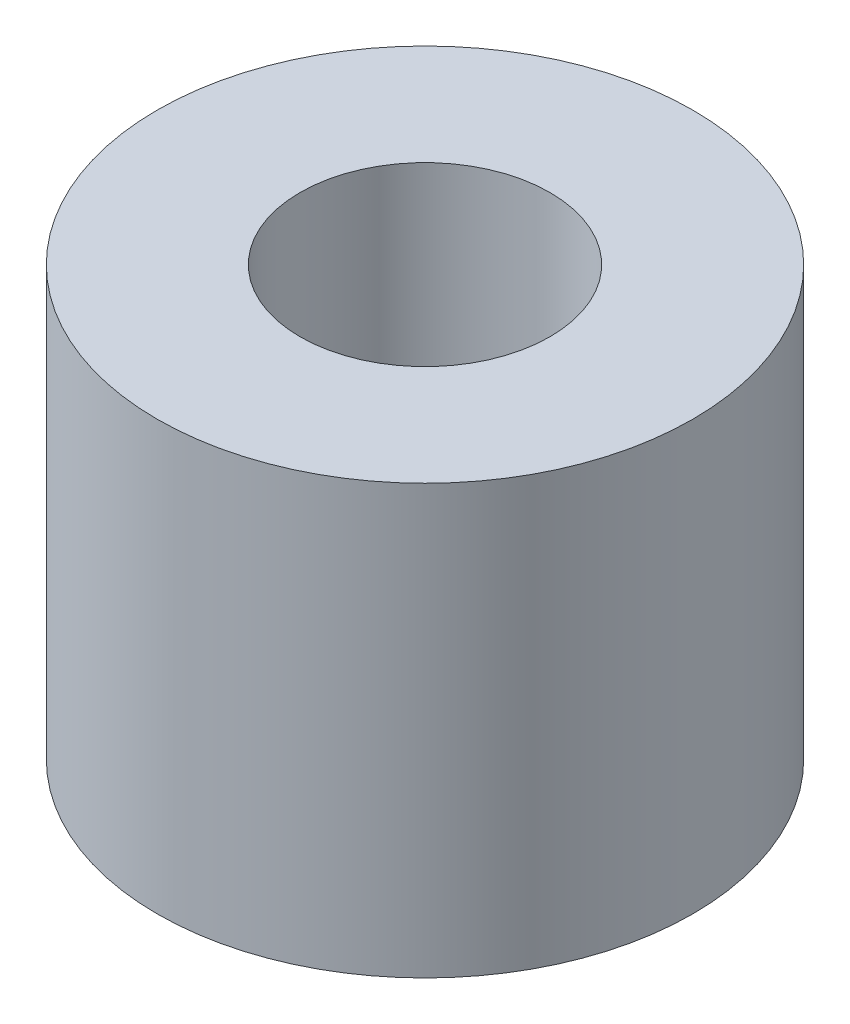
ISO-10303-21;
HEADER;
FILE_DESCRIPTION(('STEP AP214'),'2;1');
FILE_NAME('part.step','',(''),(''),'','','');
FILE_SCHEMA(('AUTOMOTIVE_DESIGN { 1 0 10303 214 1 1 1 1 }'));
ENDSEC;
DATA;
#1=APPLICATION_CONTEXT('core data for automotive mechanical design processes');
#2=APPLICATION_PROTOCOL_DEFINITION('international standard','automotive_design',2000,#1);
#3=PRODUCT_CONTEXT('',#1,'mechanical');
#4=PRODUCT('Part','Part','',(#3));
#5=PRODUCT_RELATED_PRODUCT_CATEGORY('part','',(#4));
#6=PRODUCT_DEFINITION_FORMATION('','',#4);
#7=PRODUCT_DEFINITION_CONTEXT('part definition',#1,'design');
#8=PRODUCT_DEFINITION('design','',#6,#7);
#9=PRODUCT_DEFINITION_SHAPE('','',#8);
#10=(LENGTH_UNIT() NAMED_UNIT(*) SI_UNIT(.MILLI.,.METRE.));
#11=(NAMED_UNIT(*) PLANE_ANGLE_UNIT() SI_UNIT($,.RADIAN.));
#12=(NAMED_UNIT(*) SI_UNIT($,.STERADIAN.) SOLID_ANGLE_UNIT());
#13=UNCERTAINTY_MEASURE_WITH_UNIT(LENGTH_MEASURE(1.E-05),#10,'distance_accuracy_value','');
#14=(GEOMETRIC_REPRESENTATION_CONTEXT(3) GLOBAL_UNCERTAINTY_ASSIGNED_CONTEXT((#13)) GLOBAL_UNIT_ASSIGNED_CONTEXT((#10,
#11,#12)) REPRESENTATION_CONTEXT('',''));
#15=CARTESIAN_POINT('',(0.,0.,0.));
#16=DIRECTION('',(0.,0.,1.));
#17=DIRECTION('',(1.,0.,0.));
#18=AXIS2_PLACEMENT_3D('',#15,#16,#17);
#19=CARTESIAN_POINT('',(0.,38.1,0.));
#20=DIRECTION('',(0.,1.,0.));
#21=DIRECTION('',(0.,0.,1.));
#22=AXIS2_PLACEMENT_3D('',#19,#20,#21);
#23=PLANE('',#22);
#24=CARTESIAN_POINT('',(0.,38.1,0.));
#25=DIRECTION('',(0.,1.,0.));
#26=DIRECTION('',(0.,0.,1.));
#27=AXIS2_PLACEMENT_3D('',#24,#25,#26);
#28=CIRCLE('',#27,23.8125);
#29=CARTESIAN_POINT('',(0.,38.1,-23.8125));
#30=VERTEX_POINT('',#29);
#31=EDGE_CURVE('E10',#30,#30,#28,.T.);
#32=ORIENTED_EDGE('',*,*,#31,.T.);
#33=EDGE_LOOP('',(#32));
#34=FACE_BOUND('',#33,.T.);
#35=CARTESIAN_POINT('',(0.,38.1,0.));
#36=DIRECTION('',(0.,1.,0.));
#37=DIRECTION('',(0.,0.,1.));
#38=AXIS2_PLACEMENT_3D('',#35,#36,#37);
#39=CIRCLE('',#38,11.1125);
#40=CARTESIAN_POINT('',(0.,38.1,-11.1125));
#41=VERTEX_POINT('',#40);
#42=EDGE_CURVE('E56',#41,#41,#39,.T.);
#43=ORIENTED_EDGE('',*,*,#42,.F.);
#44=EDGE_LOOP('',(#43));
#45=FACE_BOUND('',#44,.T.);
#46=ADVANCED_FACE('F43',(#34,#45),#23,.T.);
#47=CARTESIAN_POINT('',(0.,0.,0.));
#48=DIRECTION('',(0.,1.,0.));
#49=DIRECTION('',(0.,0.,1.));
#50=AXIS2_PLACEMENT_3D('',#47,#48,#49);
#51=PLANE('',#50);
#52=CARTESIAN_POINT('',(0.,0.,0.));
#53=DIRECTION('',(0.,1.,0.));
#54=DIRECTION('',(0.,0.,1.));
#55=AXIS2_PLACEMENT_3D('',#52,#53,#54);
#56=CIRCLE('',#55,23.8125);
#57=CARTESIAN_POINT('',(0.,0.,-23.8125));
#58=VERTEX_POINT('',#57);
#59=EDGE_CURVE('E47',#58,#58,#56,.T.);
#60=ORIENTED_EDGE('',*,*,#59,.F.);
#61=EDGE_LOOP('',(#60));
#62=FACE_BOUND('',#61,.T.);
#63=CARTESIAN_POINT('',(0.,0.,0.));
#64=DIRECTION('',(0.,1.,0.));
#65=DIRECTION('',(0.,0.,1.));
#66=AXIS2_PLACEMENT_3D('',#63,#64,#65);
#67=CIRCLE('',#66,11.1125);
#68=CARTESIAN_POINT('',(0.,0.,-11.1125));
#69=VERTEX_POINT('',#68);
#70=EDGE_CURVE('E58',#69,#69,#67,.T.);
#71=ORIENTED_EDGE('',*,*,#70,.T.);
#72=EDGE_LOOP('',(#71));
#73=FACE_BOUND('',#72,.T.);
#74=ADVANCED_FACE('F70',(#62,#73),#51,.F.);
#75=CARTESIAN_POINT('',(0.,38.1,0.));
#76=DIRECTION('',(0.,-1.,0.));
#77=DIRECTION('',(0.,0.,-1.));
#78=AXIS2_PLACEMENT_3D('',#75,#76,#77);
#79=CYLINDRICAL_SURFACE('',#78,23.8125);
#80=CARTESIAN_POINT('',(0.,38.1,-23.8125));
#81=CARTESIAN_POINT('',(0.,37.703125,-23.8125));
#82=CARTESIAN_POINT('',(0.,37.30625,-23.8125));
#83=CARTESIAN_POINT('',(0.,36.5125,-23.8125));
#84=CARTESIAN_POINT('',(0.,36.115625,-23.8125));
#85=CARTESIAN_POINT('',(0.,35.321875,-23.8125));
#86=CARTESIAN_POINT('',(0.,34.925,-23.8125));
#87=CARTESIAN_POINT('',(0.,34.13125,-23.8125));
#88=CARTESIAN_POINT('',(0.,33.734375,-23.8125));
#89=CARTESIAN_POINT('',(0.,32.940625,-23.8125));
#90=CARTESIAN_POINT('',(0.,32.54375,-23.8125));
#91=CARTESIAN_POINT('',(0.,31.75,-23.8125));
#92=CARTESIAN_POINT('',(0.,31.353125,-23.8125));
#93=CARTESIAN_POINT('',(0.,30.559375,-23.8125));
#94=CARTESIAN_POINT('',(0.,30.1625,-23.8125));
#95=CARTESIAN_POINT('',(0.,29.36875,-23.8125));
#96=CARTESIAN_POINT('',(0.,28.971875,-23.8125));
#97=CARTESIAN_POINT('',(0.,28.178125,-23.8125));
#98=CARTESIAN_POINT('',(0.,27.78125,-23.8125));
#99=CARTESIAN_POINT('',(0.,26.9875,-23.8125));
#100=CARTESIAN_POINT('',(0.,26.590625,-23.8125));
#101=CARTESIAN_POINT('',(0.,25.796875,-23.8125));
#102=CARTESIAN_POINT('',(0.,25.4,-23.8125));
#103=CARTESIAN_POINT('',(0.,24.60625,-23.8125));
#104=CARTESIAN_POINT('',(0.,24.209375,-23.8125));
#105=CARTESIAN_POINT('',(0.,23.415625,-23.8125));
#106=CARTESIAN_POINT('',(0.,23.01875,-23.8125));
#107=CARTESIAN_POINT('',(0.,22.225,-23.8125));
#108=CARTESIAN_POINT('',(0.,21.828125,-23.8125));
#109=CARTESIAN_POINT('',(0.,21.034375,-23.8125));
#110=CARTESIAN_POINT('',(0.,20.6375,-23.8125));
#111=CARTESIAN_POINT('',(0.,19.84375,-23.8125));
#112=CARTESIAN_POINT('',(0.,19.446875,-23.8125));
#113=CARTESIAN_POINT('',(0.,18.653125,-23.8125));
#114=CARTESIAN_POINT('',(0.,18.25625,-23.8125));
#115=CARTESIAN_POINT('',(0.,17.4625,-23.8125));
#116=CARTESIAN_POINT('',(0.,17.065625,-23.8125));
#117=CARTESIAN_POINT('',(0.,16.271875,-23.8125));
#118=CARTESIAN_POINT('',(0.,15.875,-23.8125));
#119=CARTESIAN_POINT('',(0.,15.08125,-23.8125));
#120=CARTESIAN_POINT('',(0.,14.684375,-23.8125));
#121=CARTESIAN_POINT('',(0.,13.890625,-23.8125));
#122=CARTESIAN_POINT('',(0.,13.49375,-23.8125));
#123=CARTESIAN_POINT('',(0.,12.7,-23.8125));
#124=CARTESIAN_POINT('',(0.,12.303125,-23.8125));
#125=CARTESIAN_POINT('',(0.,11.509375,-23.8125));
#126=CARTESIAN_POINT('',(0.,11.1125,-23.8125));
#127=CARTESIAN_POINT('',(0.,10.31875,-23.8125));
#128=CARTESIAN_POINT('',(0.,9.921875,-23.8125));
#129=CARTESIAN_POINT('',(0.,9.128125,-23.8125));
#130=CARTESIAN_POINT('',(0.,8.73125,-23.8125));
#131=CARTESIAN_POINT('',(0.,7.9375,-23.8125));
#132=CARTESIAN_POINT('',(0.,7.540625,-23.8125));
#133=CARTESIAN_POINT('',(0.,6.746875,-23.8125));
#134=CARTESIAN_POINT('',(0.,6.35,-23.8125));
#135=CARTESIAN_POINT('',(0.,5.55625,-23.8125));
#136=CARTESIAN_POINT('',(0.,5.159375,-23.8125));
#137=CARTESIAN_POINT('',(0.,4.365625,-23.8125));
#138=CARTESIAN_POINT('',(0.,3.96875,-23.8125));
#139=CARTESIAN_POINT('',(0.,3.175,-23.8125));
#140=CARTESIAN_POINT('',(0.,2.778125,-23.8125));
#141=CARTESIAN_POINT('',(0.,1.984375,-23.8125));
#142=CARTESIAN_POINT('',(0.,1.5875,-23.8125));
#143=CARTESIAN_POINT('',(0.,0.79375,-23.8125));
#144=CARTESIAN_POINT('',(0.,0.396875,-23.8125));
#145=CARTESIAN_POINT('',(0.,0.,-23.8125));
#146=B_SPLINE_CURVE_WITH_KNOTS('',3,(#80,#81,#82,#83,#84,#85,#86,#87,#88,#89,#90,#91,#92,#93,
#94,#95,#96,#97,#98,#99,#100,#101,#102,#103,#104,#105,#106,#107,#108,#109,#110,#111,#112,#113,
#114,#115,#116,#117,#118,#119,#120,#121,#122,#123,#124,#125,#126,#127,#128,#129,#130,#131,#132,
#133,#134,#135,#136,#137,#138,#139,#140,#141,#142,#143,#144,#145),.UNSPECIFIED.,.F.,.F.,(4,2,2,
2,2,2,2,2,2,2,2,2,2,2,2,2,2,2,2,2,2,2,2,2,2,2,2,2,2,2,2,2,4),(0.,1.19062499999999,
2.38124999999999,3.571875,4.7625,5.953125,7.14375,8.33437499999999,9.525,10.715625,11.90625,
13.096875,14.2875,15.478125,16.66875,17.859375,19.05,20.240625,21.43125,22.621875,23.8125,
25.003125,26.19375,27.384375,28.575,29.765625,30.95625,32.146875,33.3375,34.528125,35.71875,
36.909375,38.1),.UNSPECIFIED.);
#147=EDGE_CURVE('BSEAM45',#30,#58,#146,.T.);
#148=ORIENTED_EDGE('',*,*,#31,.F.);
#149=ORIENTED_EDGE('',*,*,#59,.T.);
#150=ORIENTED_EDGE('',*,*,#147,.T.);
#151=ORIENTED_EDGE('',*,*,#147,.F.);
#152=EDGE_LOOP('',(#148,#150,#149,#151));
#153=FACE_BOUND('',#152,.T.);
#154=ADVANCED_FACE('F45',(#153),#79,.T.);
#155=CARTESIAN_POINT('',(0.,38.1,0.));
#156=DIRECTION('',(0.,-1.,0.));
#157=DIRECTION('',(0.,0.,-1.));
#158=AXIS2_PLACEMENT_3D('',#155,#156,#157);
#159=CYLINDRICAL_SURFACE('',#158,11.1125);
#160=CARTESIAN_POINT('',(0.,38.1,-11.1125));
#161=CARTESIAN_POINT('',(0.,37.703125,-11.1125));
#162=CARTESIAN_POINT('',(0.,37.30625,-11.1125));
#163=CARTESIAN_POINT('',(0.,36.5125,-11.1125));
#164=CARTESIAN_POINT('',(0.,36.115625,-11.1125));
#165=CARTESIAN_POINT('',(0.,35.321875,-11.1125));
#166=CARTESIAN_POINT('',(0.,34.925,-11.1125));
#167=CARTESIAN_POINT('',(0.,34.13125,-11.1125));
#168=CARTESIAN_POINT('',(0.,33.734375,-11.1125));
#169=CARTESIAN_POINT('',(0.,32.940625,-11.1125));
#170=CARTESIAN_POINT('',(0.,32.54375,-11.1125));
#171=CARTESIAN_POINT('',(0.,31.75,-11.1125));
#172=CARTESIAN_POINT('',(0.,31.353125,-11.1125));
#173=CARTESIAN_POINT('',(0.,30.559375,-11.1125));
#174=CARTESIAN_POINT('',(0.,30.1625,-11.1125));
#175=CARTESIAN_POINT('',(0.,29.36875,-11.1125));
#176=CARTESIAN_POINT('',(0.,28.971875,-11.1125));
#177=CARTESIAN_POINT('',(0.,28.178125,-11.1125));
#178=CARTESIAN_POINT('',(0.,27.78125,-11.1125));
#179=CARTESIAN_POINT('',(0.,26.9875,-11.1125));
#180=CARTESIAN_POINT('',(0.,26.590625,-11.1125));
#181=CARTESIAN_POINT('',(0.,25.796875,-11.1125));
#182=CARTESIAN_POINT('',(0.,25.4,-11.1125));
#183=CARTESIAN_POINT('',(0.,24.60625,-11.1125));
#184=CARTESIAN_POINT('',(0.,24.209375,-11.1125));
#185=CARTESIAN_POINT('',(0.,23.415625,-11.1125));
#186=CARTESIAN_POINT('',(0.,23.01875,-11.1125));
#187=CARTESIAN_POINT('',(0.,22.225,-11.1125));
#188=CARTESIAN_POINT('',(0.,21.828125,-11.1125));
#189=CARTESIAN_POINT('',(0.,21.034375,-11.1125));
#190=CARTESIAN_POINT('',(0.,20.6375,-11.1125));
#191=CARTESIAN_POINT('',(0.,19.84375,-11.1125));
#192=CARTESIAN_POINT('',(0.,19.446875,-11.1125));
#193=CARTESIAN_POINT('',(0.,18.653125,-11.1125));
#194=CARTESIAN_POINT('',(0.,18.25625,-11.1125));
#195=CARTESIAN_POINT('',(0.,17.4625,-11.1125));
#196=CARTESIAN_POINT('',(0.,17.065625,-11.1125));
#197=CARTESIAN_POINT('',(0.,16.271875,-11.1125));
#198=CARTESIAN_POINT('',(0.,15.875,-11.1125));
#199=CARTESIAN_POINT('',(0.,15.08125,-11.1125));
#200=CARTESIAN_POINT('',(0.,14.684375,-11.1125));
#201=CARTESIAN_POINT('',(0.,13.890625,-11.1125));
#202=CARTESIAN_POINT('',(0.,13.49375,-11.1125));
#203=CARTESIAN_POINT('',(0.,12.7,-11.1125));
#204=CARTESIAN_POINT('',(0.,12.303125,-11.1125));
#205=CARTESIAN_POINT('',(0.,11.509375,-11.1125));
#206=CARTESIAN_POINT('',(0.,11.1125,-11.1125));
#207=CARTESIAN_POINT('',(0.,10.31875,-11.1125));
#208=CARTESIAN_POINT('',(0.,9.921875,-11.1125));
#209=CARTESIAN_POINT('',(0.,9.128125,-11.1125));
#210=CARTESIAN_POINT('',(0.,8.73125,-11.1125));
#211=CARTESIAN_POINT('',(0.,7.9375,-11.1125));
#212=CARTESIAN_POINT('',(0.,7.540625,-11.1125));
#213=CARTESIAN_POINT('',(0.,6.746875,-11.1125));
#214=CARTESIAN_POINT('',(0.,6.35,-11.1125));
#215=CARTESIAN_POINT('',(0.,5.55625,-11.1125));
#216=CARTESIAN_POINT('',(0.,5.159375,-11.1125));
#217=CARTESIAN_POINT('',(0.,4.365625,-11.1125));
#218=CARTESIAN_POINT('',(0.,3.96875,-11.1125));
#219=CARTESIAN_POINT('',(0.,3.175,-11.1125));
#220=CARTESIAN_POINT('',(0.,2.778125,-11.1125));
#221=CARTESIAN_POINT('',(0.,1.984375,-11.1125));
#222=CARTESIAN_POINT('',(0.,1.5875,-11.1125));
#223=CARTESIAN_POINT('',(0.,0.79375,-11.1125));
#224=CARTESIAN_POINT('',(0.,0.396875,-11.1125));
#225=CARTESIAN_POINT('',(0.,0.,-11.1125));
#226=B_SPLINE_CURVE_WITH_KNOTS('',3,(#160,#161,#162,#163,#164,#165,#166,#167,#168,#169,#170,
#171,#172,#173,#174,#175,#176,#177,#178,#179,#180,#181,#182,#183,#184,#185,#186,#187,#188,#189,
#190,#191,#192,#193,#194,#195,#196,#197,#198,#199,#200,#201,#202,#203,#204,#205,#206,#207,#208,
#209,#210,#211,#212,#213,#214,#215,#216,#217,#218,#219,#220,#221,#222,#223,#224,#225),
.UNSPECIFIED.,.F.,.F.,(4,2,2,2,2,2,2,2,2,2,2,2,2,2,2,2,2,2,2,2,2,2,2,2,2,2,2,2,2,2,2,2,4),(0.,
1.19062499999999,2.38124999999999,3.571875,4.7625,5.953125,7.14375,8.33437499999999,9.525,
10.715625,11.90625,13.096875,14.2875,15.478125,16.66875,17.859375,19.05,20.240625,21.43125,
22.621875,23.8125,25.003125,26.19375,27.384375,28.575,29.765625,30.95625,32.146875,33.3375,
34.528125,35.71875,36.909375,38.1),.UNSPECIFIED.);
#227=EDGE_CURVE('BSEAM66',#41,#69,#226,.T.);
#228=ORIENTED_EDGE('',*,*,#42,.T.);
#229=ORIENTED_EDGE('',*,*,#70,.F.);
#230=ORIENTED_EDGE('',*,*,#227,.T.);
#231=ORIENTED_EDGE('',*,*,#227,.F.);
#232=EDGE_LOOP('',(#228,#230,#229,#231));
#233=FACE_BOUND('',#232,.T.);
#234=ADVANCED_FACE('F66',(#233),#159,.F.);
#235=CLOSED_SHELL('',(#46,#74,#154,#234));
#236=MANIFOLD_SOLID_BREP('B2',#235);
#237=ADVANCED_BREP_SHAPE_REPRESENTATION('',(#18,#236),#14);
#238=SHAPE_DEFINITION_REPRESENTATION(#9,#237);
ENDSEC;
END-ISO-10303-21;
